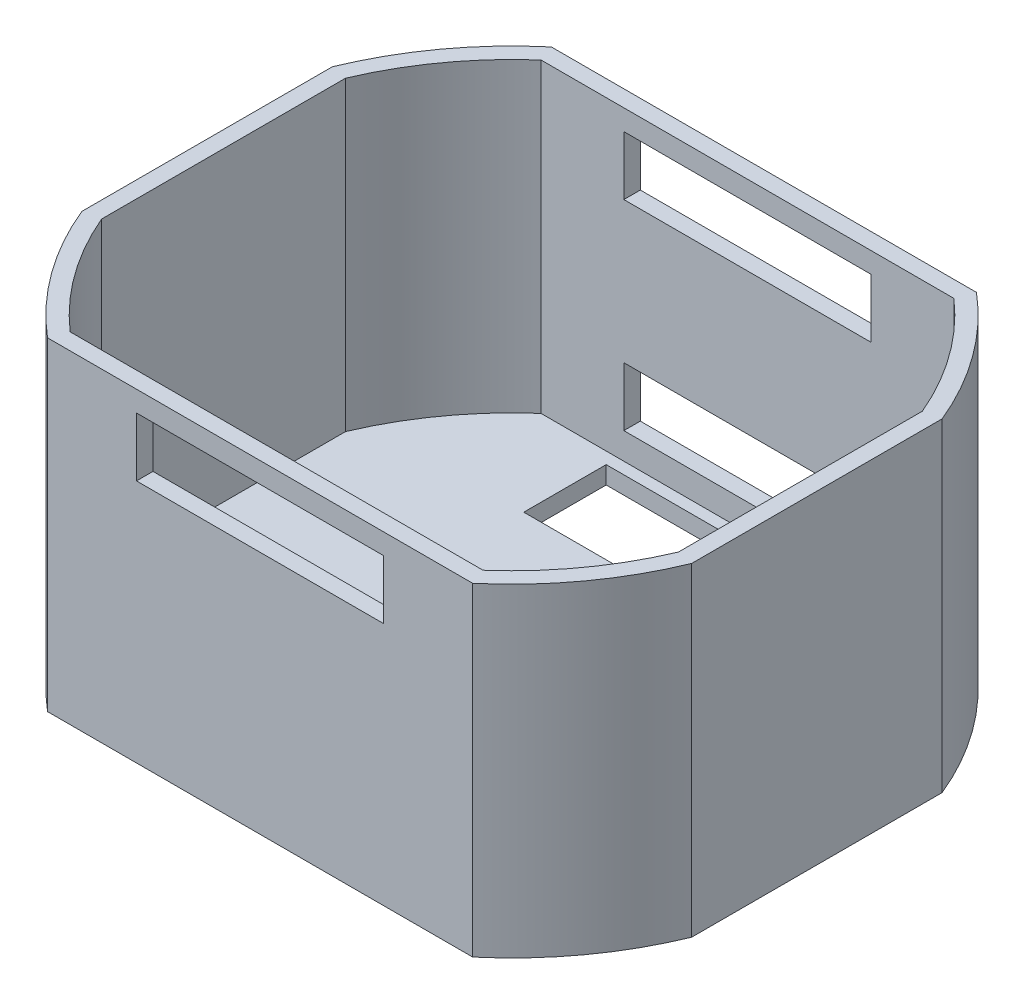
ISO-10303-21;
HEADER;
FILE_DESCRIPTION(('STEP AP214'),'2;1');
FILE_NAME('part.step','',(''),(''),'','','');
FILE_SCHEMA(('AUTOMOTIVE_DESIGN { 1 0 10303 214 1 1 1 1 }'));
ENDSEC;
DATA;
#1=APPLICATION_CONTEXT('core data for automotive mechanical design processes');
#2=APPLICATION_PROTOCOL_DEFINITION('international standard','automotive_design',2000,#1);
#3=PRODUCT_CONTEXT('',#1,'mechanical');
#4=PRODUCT('Part','Part','',(#3));
#5=PRODUCT_RELATED_PRODUCT_CATEGORY('part','',(#4));
#6=PRODUCT_DEFINITION_FORMATION('','',#4);
#7=PRODUCT_DEFINITION_CONTEXT('part definition',#1,'design');
#8=PRODUCT_DEFINITION('design','',#6,#7);
#9=PRODUCT_DEFINITION_SHAPE('','',#8);
#10=(LENGTH_UNIT() NAMED_UNIT(*) SI_UNIT(.MILLI.,.METRE.));
#11=(NAMED_UNIT(*) PLANE_ANGLE_UNIT() SI_UNIT($,.RADIAN.));
#12=(NAMED_UNIT(*) SI_UNIT($,.STERADIAN.) SOLID_ANGLE_UNIT());
#13=UNCERTAINTY_MEASURE_WITH_UNIT(LENGTH_MEASURE(1.E-05),#10,'distance_accuracy_value','');
#14=(GEOMETRIC_REPRESENTATION_CONTEXT(3) GLOBAL_UNCERTAINTY_ASSIGNED_CONTEXT((#13)) GLOBAL_UNIT_ASSIGNED_CONTEXT((#10,
#11,#12)) REPRESENTATION_CONTEXT('',''));
#15=CARTESIAN_POINT('',(0.,0.,0.));
#16=DIRECTION('',(0.,0.,1.));
#17=DIRECTION('',(1.,0.,0.));
#18=AXIS2_PLACEMENT_3D('',#15,#16,#17);
#19=CARTESIAN_POINT('',(0.,13.75,0.));
#20=DIRECTION('',(0.,-1.,0.));
#21=DIRECTION('',(0.,0.,-1.));
#22=AXIS2_PLACEMENT_3D('',#19,#20,#21);
#23=CYLINDRICAL_SURFACE('',#22,26.6);
#24=DIRECTION('',(0.,-1.,0.));
#25=VECTOR('',#24,1.);
#26=CARTESIAN_POINT('',(-24.5,13.75,-10.3590540108641));
#27=LINE('',#26,#25);
#28=CARTESIAN_POINT('',(-24.5,13.75,-10.3590540108641));
#29=VERTEX_POINT('',#28);
#30=CARTESIAN_POINT('',(-24.5,-12.25,-10.3590540108641));
#31=VERTEX_POINT('',#30);
#32=EDGE_CURVE('E414',#29,#31,#27,.T.);
#33=ORIENTED_EDGE('',*,*,#32,.T.);
#34=CARTESIAN_POINT('',(0.,-12.25,0.));
#35=DIRECTION('',(0.,-1.,0.));
#36=DIRECTION('',(0.,0.,-1.));
#37=AXIS2_PLACEMENT_3D('',#34,#35,#36);
#38=CIRCLE('',#37,26.6);
#39=CARTESIAN_POINT('',(-17.5373886311503,-12.25,-20.));
#40=VERTEX_POINT('',#39);
#41=EDGE_CURVE('E326',#31,#40,#38,.T.);
#42=ORIENTED_EDGE('',*,*,#41,.T.);
#43=DIRECTION('',(0.,-1.,0.));
#44=VECTOR('',#43,1.);
#45=CARTESIAN_POINT('',(-17.5373886311503,13.75,-20.));
#46=LINE('',#45,#44);
#47=CARTESIAN_POINT('',(-17.5373886311503,13.75,-20.));
#48=VERTEX_POINT('',#47);
#49=EDGE_CURVE('E393',#48,#40,#46,.T.);
#50=ORIENTED_EDGE('',*,*,#49,.F.);
#51=CARTESIAN_POINT('',(0.,13.75,0.));
#52=DIRECTION('',(0.,1.,0.));
#53=DIRECTION('',(0.,0.,1.));
#54=AXIS2_PLACEMENT_3D('',#51,#52,#53);
#55=CIRCLE('',#54,26.6);
#56=EDGE_CURVE('E376',#48,#29,#55,.T.);
#57=ORIENTED_EDGE('',*,*,#56,.T.);
#58=EDGE_LOOP('',(#33,#42,#50,#57));
#59=FACE_BOUND('',#58,.T.);
#60=ADVANCED_FACE('F33',(#59),#23,.F.);
#61=CARTESIAN_POINT('',(-24.5,13.75,-10.3590540108641));
#62=DIRECTION('',(1.,0.,0.));
#63=DIRECTION('',(0.,0.,-1.));
#64=AXIS2_PLACEMENT_3D('',#61,#62,#63);
#65=PLANE('',#64);
#66=DIRECTION('',(0.,-1.,0.));
#67=VECTOR('',#66,1.);
#68=CARTESIAN_POINT('',(-24.5,13.75,10.3590540108641));
#69=LINE('',#68,#67);
#70=CARTESIAN_POINT('',(-24.5,13.75,10.3590540108641));
#71=VERTEX_POINT('',#70);
#72=CARTESIAN_POINT('',(-24.5,-12.25,10.3590540108641));
#73=VERTEX_POINT('',#72);
#74=EDGE_CURVE('E411',#71,#73,#69,.T.);
#75=ORIENTED_EDGE('',*,*,#74,.T.);
#76=DIRECTION('',(0.,0.,-1.));
#77=VECTOR('',#76,1.);
#78=CARTESIAN_POINT('',(-24.5,-12.25,-10.3590540108641));
#79=LINE('',#78,#77);
#80=EDGE_CURVE('E323',#73,#31,#79,.T.);
#81=ORIENTED_EDGE('',*,*,#80,.T.);
#82=ORIENTED_EDGE('',*,*,#32,.F.);
#83=DIRECTION('',(0.,0.,1.));
#84=VECTOR('',#83,1.);
#85=CARTESIAN_POINT('',(-24.5,13.75,-10.3590540108641));
#86=LINE('',#85,#84);
#87=EDGE_CURVE('E378',#29,#71,#86,.T.);
#88=ORIENTED_EDGE('',*,*,#87,.T.);
#89=EDGE_LOOP('',(#75,#81,#82,#88));
#90=FACE_BOUND('',#89,.T.);
#91=ADVANCED_FACE('F516',(#90),#65,.T.);
#92=CARTESIAN_POINT('',(0.,13.75,0.));
#93=DIRECTION('',(0.,-1.,0.));
#94=DIRECTION('',(0.,0.,-1.));
#95=AXIS2_PLACEMENT_3D('',#92,#93,#94);
#96=CYLINDRICAL_SURFACE('',#95,26.6);
#97=DIRECTION('',(0.,-1.,0.));
#98=VECTOR('',#97,1.);
#99=CARTESIAN_POINT('',(-17.5373886311503,13.75,20.));
#100=LINE('',#99,#98);
#101=CARTESIAN_POINT('',(-17.5373886311503,13.75,20.));
#102=VERTEX_POINT('',#101);
#103=CARTESIAN_POINT('',(-17.5373886311503,-12.25,20.));
#104=VERTEX_POINT('',#103);
#105=EDGE_CURVE('E408',#102,#104,#100,.T.);
#106=ORIENTED_EDGE('',*,*,#105,.T.);
#107=CARTESIAN_POINT('',(0.,-12.25,0.));
#108=DIRECTION('',(0.,-1.,0.));
#109=DIRECTION('',(0.,0.,-1.));
#110=AXIS2_PLACEMENT_3D('',#107,#108,#109);
#111=CIRCLE('',#110,26.6);
#112=EDGE_CURVE('E320',#104,#73,#111,.T.);
#113=ORIENTED_EDGE('',*,*,#112,.T.);
#114=ORIENTED_EDGE('',*,*,#74,.F.);
#115=CARTESIAN_POINT('',(0.,13.75,0.));
#116=DIRECTION('',(0.,1.,0.));
#117=DIRECTION('',(0.,0.,1.));
#118=AXIS2_PLACEMENT_3D('',#115,#116,#117);
#119=CIRCLE('',#118,26.6);
#120=EDGE_CURVE('E380',#71,#102,#119,.T.);
#121=ORIENTED_EDGE('',*,*,#120,.T.);
#122=EDGE_LOOP('',(#106,#113,#114,#121));
#123=FACE_BOUND('',#122,.T.);
#124=ADVANCED_FACE('F522',(#123),#96,.F.);
#125=CARTESIAN_POINT('',(-17.5373886311503,13.75,20.));
#126=DIRECTION('',(0.,0.,-1.));
#127=DIRECTION('',(-1.,0.,0.));
#128=AXIS2_PLACEMENT_3D('',#125,#126,#127);
#129=PLANE('',#128);
#130=DIRECTION('',(0.,-1.,0.));
#131=VECTOR('',#130,1.);
#132=CARTESIAN_POINT('',(10.5,13.75,20.));
#133=LINE('',#132,#131);
#134=CARTESIAN_POINT('',(10.5,12.,20.));
#135=VERTEX_POINT('',#134);
#136=CARTESIAN_POINT('',(10.5,7.,20.));
#137=VERTEX_POINT('',#136);
#138=EDGE_CURVE('E374',#135,#137,#133,.T.);
#139=ORIENTED_EDGE('',*,*,#138,.F.);
#140=DIRECTION('',(1.,0.,0.));
#141=VECTOR('',#140,1.);
#142=CARTESIAN_POINT('',(-17.5373886311503,12.,20.));
#143=LINE('',#142,#141);
#144=CARTESIAN_POINT('',(-10.5,12.,20.));
#145=VERTEX_POINT('',#144);
#146=EDGE_CURVE('E356',#145,#135,#143,.T.);
#147=ORIENTED_EDGE('',*,*,#146,.F.);
#148=DIRECTION('',(0.,1.,0.));
#149=VECTOR('',#148,1.);
#150=CARTESIAN_POINT('',(-10.5,13.75,20.));
#151=LINE('',#150,#149);
#152=CARTESIAN_POINT('',(-10.5,7.,20.));
#153=VERTEX_POINT('',#152);
#154=EDGE_CURVE('E369',#153,#145,#151,.T.);
#155=ORIENTED_EDGE('',*,*,#154,.F.);
#156=DIRECTION('',(-1.,0.,0.));
#157=VECTOR('',#156,1.);
#158=CARTESIAN_POINT('',(-17.5373886311503,7.,20.));
#159=LINE('',#158,#157);
#160=EDGE_CURVE('E372',#137,#153,#159,.T.);
#161=ORIENTED_EDGE('',*,*,#160,.F.);
#162=EDGE_LOOP('',(#139,#147,#155,#161));
#163=FACE_BOUND('',#162,.T.);
#164=DIRECTION('',(0.,-1.,0.));
#165=VECTOR('',#164,1.);
#166=CARTESIAN_POINT('',(17.5373886311503,13.75,20.));
#167=LINE('',#166,#165);
#168=CARTESIAN_POINT('',(17.5373886311503,13.75,20.));
#169=VERTEX_POINT('',#168);
#170=CARTESIAN_POINT('',(17.5373886311503,-12.25,20.));
#171=VERTEX_POINT('',#170);
#172=EDGE_CURVE('E405',#169,#171,#167,.T.);
#173=ORIENTED_EDGE('',*,*,#172,.T.);
#174=DIRECTION('',(-1.,0.,0.));
#175=VECTOR('',#174,1.);
#176=CARTESIAN_POINT('',(-17.5373886311503,-12.25,20.));
#177=LINE('',#176,#175);
#178=EDGE_CURVE('E317',#171,#104,#177,.T.);
#179=ORIENTED_EDGE('',*,*,#178,.T.);
#180=ORIENTED_EDGE('',*,*,#105,.F.);
#181=DIRECTION('',(1.,0.,0.));
#182=VECTOR('',#181,1.);
#183=CARTESIAN_POINT('',(-17.5373886311503,13.75,20.));
#184=LINE('',#183,#182);
#185=EDGE_CURVE('E382',#102,#169,#184,.T.);
#186=ORIENTED_EDGE('',*,*,#185,.T.);
#187=EDGE_LOOP('',(#173,#179,#180,#186));
#188=FACE_BOUND('',#187,.T.);
#189=ADVANCED_FACE('F605',(#163,#188),#129,.T.);
#190=CARTESIAN_POINT('',(0.,13.75,0.));
#191=DIRECTION('',(0.,-1.,0.));
#192=DIRECTION('',(0.,0.,-1.));
#193=AXIS2_PLACEMENT_3D('',#190,#191,#192);
#194=CYLINDRICAL_SURFACE('',#193,26.6);
#195=DIRECTION('',(0.,-1.,0.));
#196=VECTOR('',#195,1.);
#197=CARTESIAN_POINT('',(24.5,13.75,10.3590540108641));
#198=LINE('',#197,#196);
#199=CARTESIAN_POINT('',(24.5,13.75,10.3590540108641));
#200=VERTEX_POINT('',#199);
#201=CARTESIAN_POINT('',(24.5,-12.25,10.3590540108641));
#202=VERTEX_POINT('',#201);
#203=EDGE_CURVE('E402',#200,#202,#198,.T.);
#204=ORIENTED_EDGE('',*,*,#203,.T.);
#205=CARTESIAN_POINT('',(0.,-12.25,0.));
#206=DIRECTION('',(0.,-1.,0.));
#207=DIRECTION('',(0.,0.,-1.));
#208=AXIS2_PLACEMENT_3D('',#205,#206,#207);
#209=CIRCLE('',#208,26.6);
#210=EDGE_CURVE('E314',#202,#171,#209,.T.);
#211=ORIENTED_EDGE('',*,*,#210,.T.);
#212=ORIENTED_EDGE('',*,*,#172,.F.);
#213=CARTESIAN_POINT('',(0.,13.75,0.));
#214=DIRECTION('',(0.,1.,0.));
#215=DIRECTION('',(0.,0.,1.));
#216=AXIS2_PLACEMENT_3D('',#213,#214,#215);
#217=CIRCLE('',#216,26.6);
#218=EDGE_CURVE('E384',#169,#200,#217,.T.);
#219=ORIENTED_EDGE('',*,*,#218,.T.);
#220=EDGE_LOOP('',(#204,#211,#212,#219));
#221=FACE_BOUND('',#220,.T.);
#222=ADVANCED_FACE('F627',(#221),#194,.F.);
#223=CARTESIAN_POINT('',(24.5,13.75,-10.3590540108641));
#224=DIRECTION('',(-1.,0.,0.));
#225=DIRECTION('',(0.,0.,1.));
#226=AXIS2_PLACEMENT_3D('',#223,#224,#225);
#227=PLANE('',#226);
#228=DIRECTION('',(0.,-1.,0.));
#229=VECTOR('',#228,1.);
#230=CARTESIAN_POINT('',(24.5,13.75,-10.3590540108641));
#231=LINE('',#230,#229);
#232=CARTESIAN_POINT('',(24.5,13.75,-10.3590540108641));
#233=VERTEX_POINT('',#232);
#234=CARTESIAN_POINT('',(24.5,-12.25,-10.3590540108641));
#235=VERTEX_POINT('',#234);
#236=EDGE_CURVE('E399',#233,#235,#231,.T.);
#237=ORIENTED_EDGE('',*,*,#236,.T.);
#238=DIRECTION('',(0.,0.,1.));
#239=VECTOR('',#238,1.);
#240=CARTESIAN_POINT('',(24.5,-12.25,-10.3590540108641));
#241=LINE('',#240,#239);
#242=EDGE_CURVE('E311',#235,#202,#241,.T.);
#243=ORIENTED_EDGE('',*,*,#242,.T.);
#244=ORIENTED_EDGE('',*,*,#203,.F.);
#245=DIRECTION('',(0.,0.,-1.));
#246=VECTOR('',#245,1.);
#247=CARTESIAN_POINT('',(24.5,13.75,-10.3590540108641));
#248=LINE('',#247,#246);
#249=EDGE_CURVE('E386',#200,#233,#248,.T.);
#250=ORIENTED_EDGE('',*,*,#249,.T.);
#251=EDGE_LOOP('',(#237,#243,#244,#250));
#252=FACE_BOUND('',#251,.T.);
#253=ADVANCED_FACE('F623',(#252),#227,.T.);
#254=CARTESIAN_POINT('',(0.,13.75,0.));
#255=DIRECTION('',(0.,-1.,0.));
#256=DIRECTION('',(0.,0.,-1.));
#257=AXIS2_PLACEMENT_3D('',#254,#255,#256);
#258=CYLINDRICAL_SURFACE('',#257,26.6);
#259=DIRECTION('',(0.,-1.,0.));
#260=VECTOR('',#259,1.);
#261=CARTESIAN_POINT('',(17.5373886311503,13.75,-20.));
#262=LINE('',#261,#260);
#263=CARTESIAN_POINT('',(17.5373886311503,13.75,-20.));
#264=VERTEX_POINT('',#263);
#265=CARTESIAN_POINT('',(17.5373886311503,-12.25,-20.));
#266=VERTEX_POINT('',#265);
#267=EDGE_CURVE('E396',#264,#266,#262,.T.);
#268=ORIENTED_EDGE('',*,*,#267,.T.);
#269=CARTESIAN_POINT('',(0.,-12.25,0.));
#270=DIRECTION('',(0.,-1.,0.));
#271=DIRECTION('',(0.,0.,-1.));
#272=AXIS2_PLACEMENT_3D('',#269,#270,#271);
#273=CIRCLE('',#272,26.6);
#274=EDGE_CURVE('E308',#266,#235,#273,.T.);
#275=ORIENTED_EDGE('',*,*,#274,.T.);
#276=ORIENTED_EDGE('',*,*,#236,.F.);
#277=CARTESIAN_POINT('',(0.,13.75,0.));
#278=DIRECTION('',(0.,1.,0.));
#279=DIRECTION('',(0.,0.,1.));
#280=AXIS2_PLACEMENT_3D('',#277,#278,#279);
#281=CIRCLE('',#280,26.6);
#282=EDGE_CURVE('E388',#233,#264,#281,.T.);
#283=ORIENTED_EDGE('',*,*,#282,.T.);
#284=EDGE_LOOP('',(#268,#275,#276,#283));
#285=FACE_BOUND('',#284,.T.);
#286=ADVANCED_FACE('F619',(#285),#258,.F.);
#287=CARTESIAN_POINT('',(-17.5373886311503,13.75,-20.));
#288=DIRECTION('',(0.,0.,1.));
#289=DIRECTION('',(1.,0.,0.));
#290=AXIS2_PLACEMENT_3D('',#287,#288,#289);
#291=PLANE('',#290);
#292=DIRECTION('',(0.,-1.,0.));
#293=VECTOR('',#292,1.);
#294=CARTESIAN_POINT('',(-10.5,13.75,-20.));
#295=LINE('',#294,#293);
#296=CARTESIAN_POINT('',(-10.5,-5.,-20.));
#297=VERTEX_POINT('',#296);
#298=CARTESIAN_POINT('',(-10.5,-10.,-20.));
#299=VERTEX_POINT('',#298);
#300=EDGE_CURVE('E306',#297,#299,#295,.T.);
#301=ORIENTED_EDGE('',*,*,#300,.F.);
#302=DIRECTION('',(-1.,0.,0.));
#303=VECTOR('',#302,1.);
#304=CARTESIAN_POINT('',(-17.5373886311503,-5.,-20.));
#305=LINE('',#304,#303);
#306=CARTESIAN_POINT('',(10.5,-5.,-20.));
#307=VERTEX_POINT('',#306);
#308=EDGE_CURVE('E293',#307,#297,#305,.T.);
#309=ORIENTED_EDGE('',*,*,#308,.F.);
#310=DIRECTION('',(0.,1.,0.));
#311=VECTOR('',#310,1.);
#312=CARTESIAN_POINT('',(10.5,13.75,-20.));
#313=LINE('',#312,#311);
#314=CARTESIAN_POINT('',(10.5,-10.,-20.));
#315=VERTEX_POINT('',#314);
#316=EDGE_CURVE('E301',#315,#307,#313,.T.);
#317=ORIENTED_EDGE('',*,*,#316,.F.);
#318=DIRECTION('',(1.,0.,0.));
#319=VECTOR('',#318,1.);
#320=CARTESIAN_POINT('',(-17.5373886311503,-10.,-20.));
#321=LINE('',#320,#319);
#322=EDGE_CURVE('E304',#299,#315,#321,.T.);
#323=ORIENTED_EDGE('',*,*,#322,.F.);
#324=EDGE_LOOP('',(#301,#309,#317,#323));
#325=FACE_BOUND('',#324,.T.);
#326=DIRECTION('',(0.,1.,0.));
#327=VECTOR('',#326,1.);
#328=CARTESIAN_POINT('',(10.5,13.75,-20.));
#329=LINE('',#328,#327);
#330=CARTESIAN_POINT('',(10.5,7.,-20.));
#331=VERTEX_POINT('',#330);
#332=CARTESIAN_POINT('',(10.5,12.,-20.));
#333=VERTEX_POINT('',#332);
#334=EDGE_CURVE('E41',#331,#333,#329,.T.);
#335=ORIENTED_EDGE('',*,*,#334,.F.);
#336=DIRECTION('',(1.,0.,0.));
#337=VECTOR('',#336,1.);
#338=CARTESIAN_POINT('',(-17.5373886311503,7.,-20.));
#339=LINE('',#338,#337);
#340=CARTESIAN_POINT('',(-10.5,7.,-20.));
#341=VERTEX_POINT('',#340);
#342=EDGE_CURVE('E478',#341,#331,#339,.T.);
#343=ORIENTED_EDGE('',*,*,#342,.F.);
#344=DIRECTION('',(0.,-1.,0.));
#345=VECTOR('',#344,1.);
#346=CARTESIAN_POINT('',(-10.5,13.75,-20.));
#347=LINE('',#346,#345);
#348=CARTESIAN_POINT('',(-10.5,12.,-20.));
#349=VERTEX_POINT('',#348);
#350=EDGE_CURVE('E476',#349,#341,#347,.T.);
#351=ORIENTED_EDGE('',*,*,#350,.F.);
#352=DIRECTION('',(-1.,0.,0.));
#353=VECTOR('',#352,1.);
#354=CARTESIAN_POINT('',(-17.5373886311503,12.,-20.));
#355=LINE('',#354,#353);
#356=EDGE_CURVE('E474',#333,#349,#355,.T.);
#357=ORIENTED_EDGE('',*,*,#356,.F.);
#358=EDGE_LOOP('',(#335,#343,#351,#357));
#359=FACE_BOUND('',#358,.T.);
#360=ORIENTED_EDGE('',*,*,#49,.T.);
#361=DIRECTION('',(1.,0.,0.));
#362=VECTOR('',#361,1.);
#363=CARTESIAN_POINT('',(-17.5373886311503,-12.25,-20.));
#364=LINE('',#363,#362);
#365=EDGE_CURVE('E11',#40,#266,#364,.T.);
#366=ORIENTED_EDGE('',*,*,#365,.T.);
#367=ORIENTED_EDGE('',*,*,#267,.F.);
#368=DIRECTION('',(-1.,0.,0.));
#369=VECTOR('',#368,1.);
#370=CARTESIAN_POINT('',(-17.5373886311503,13.75,-20.));
#371=LINE('',#370,#369);
#372=EDGE_CURVE('E391',#264,#48,#371,.T.);
#373=ORIENTED_EDGE('',*,*,#372,.T.);
#374=EDGE_LOOP('',(#360,#366,#367,#373));
#375=FACE_BOUND('',#374,.T.);
#376=ADVANCED_FACE('F489',(#325,#359,#375),#291,.T.);
#377=CARTESIAN_POINT('',(0.,13.75,0.));
#378=DIRECTION('',(0.,1.,0.));
#379=DIRECTION('',(0.,0.,1.));
#380=AXIS2_PLACEMENT_3D('',#377,#378,#379);
#381=PLANE('',#380);
#382=CARTESIAN_POINT('',(0.,13.75,0.));
#383=DIRECTION('',(0.,1.,0.));
#384=DIRECTION('',(0.,0.,1.));
#385=AXIS2_PLACEMENT_3D('',#382,#383,#384);
#386=CIRCLE('',#385,28.);
#387=CARTESIAN_POINT('',(-18.0565777488427,13.75,-21.4));
#388=VERTEX_POINT('',#387);
#389=CARTESIAN_POINT('',(-25.9,13.75,-10.6390789074995));
#390=VERTEX_POINT('',#389);
#391=EDGE_CURVE('E418',#388,#390,#386,.T.);
#392=ORIENTED_EDGE('',*,*,#391,.T.);
#393=DIRECTION('',(0.,0.,1.));
#394=VECTOR('',#393,1.);
#395=CARTESIAN_POINT('',(-25.9,13.75,-10.6390789074995));
#396=LINE('',#395,#394);
#397=CARTESIAN_POINT('',(-25.9,13.75,10.6390789074995));
#398=VERTEX_POINT('',#397);
#399=EDGE_CURVE('E421',#390,#398,#396,.T.);
#400=ORIENTED_EDGE('',*,*,#399,.T.);
#401=CARTESIAN_POINT('',(0.,13.75,0.));
#402=DIRECTION('',(0.,1.,0.));
#403=DIRECTION('',(0.,0.,1.));
#404=AXIS2_PLACEMENT_3D('',#401,#402,#403);
#405=CIRCLE('',#404,28.);
#406=CARTESIAN_POINT('',(-18.0565777488427,13.75,21.4));
#407=VERTEX_POINT('',#406);
#408=EDGE_CURVE('E424',#398,#407,#405,.T.);
#409=ORIENTED_EDGE('',*,*,#408,.T.);
#410=DIRECTION('',(1.,0.,0.));
#411=VECTOR('',#410,1.);
#412=CARTESIAN_POINT('',(-18.0565777488427,13.75,21.4));
#413=LINE('',#412,#411);
#414=CARTESIAN_POINT('',(18.0565777488427,13.75,21.4));
#415=VERTEX_POINT('',#414);
#416=EDGE_CURVE('E426',#407,#415,#413,.T.);
#417=ORIENTED_EDGE('',*,*,#416,.T.);
#418=CARTESIAN_POINT('',(0.,13.75,0.));
#419=DIRECTION('',(0.,1.,0.));
#420=DIRECTION('',(0.,0.,1.));
#421=AXIS2_PLACEMENT_3D('',#418,#419,#420);
#422=CIRCLE('',#421,28.);
#423=CARTESIAN_POINT('',(25.9,13.75,10.6390789074995));
#424=VERTEX_POINT('',#423);
#425=EDGE_CURVE('E428',#415,#424,#422,.T.);
#426=ORIENTED_EDGE('',*,*,#425,.T.);
#427=DIRECTION('',(0.,0.,-1.));
#428=VECTOR('',#427,1.);
#429=CARTESIAN_POINT('',(25.9,13.75,-10.6390789074995));
#430=LINE('',#429,#428);
#431=CARTESIAN_POINT('',(25.9,13.75,-10.6390789074995));
#432=VERTEX_POINT('',#431);
#433=EDGE_CURVE('E430',#424,#432,#430,.T.);
#434=ORIENTED_EDGE('',*,*,#433,.T.);
#435=CARTESIAN_POINT('',(0.,13.75,0.));
#436=DIRECTION('',(0.,1.,0.));
#437=DIRECTION('',(0.,0.,1.));
#438=AXIS2_PLACEMENT_3D('',#435,#436,#437);
#439=CIRCLE('',#438,28.);
#440=CARTESIAN_POINT('',(18.0565777488427,13.75,-21.4));
#441=VERTEX_POINT('',#440);
#442=EDGE_CURVE('E432',#432,#441,#439,.T.);
#443=ORIENTED_EDGE('',*,*,#442,.T.);
#444=DIRECTION('',(-1.,0.,0.));
#445=VECTOR('',#444,1.);
#446=CARTESIAN_POINT('',(-18.0565777488427,13.75,-21.4));
#447=LINE('',#446,#445);
#448=EDGE_CURVE('E434',#441,#388,#447,.T.);
#449=ORIENTED_EDGE('',*,*,#448,.T.);
#450=EDGE_LOOP('',(#392,#400,#409,#417,#426,#434,#443,#449));
#451=FACE_BOUND('',#450,.T.);
#452=ORIENTED_EDGE('',*,*,#87,.F.);
#453=ORIENTED_EDGE('',*,*,#56,.F.);
#454=ORIENTED_EDGE('',*,*,#372,.F.);
#455=ORIENTED_EDGE('',*,*,#282,.F.);
#456=ORIENTED_EDGE('',*,*,#249,.F.);
#457=ORIENTED_EDGE('',*,*,#218,.F.);
#458=ORIENTED_EDGE('',*,*,#185,.F.);
#459=ORIENTED_EDGE('',*,*,#120,.F.);
#460=EDGE_LOOP('',(#452,#453,#454,#455,#456,#457,#458,#459));
#461=FACE_BOUND('',#460,.T.);
#462=ADVANCED_FACE('F527',(#451,#461),#381,.T.);
#463=CARTESIAN_POINT('',(0.,-13.75,0.));
#464=DIRECTION('',(0.,1.,0.));
#465=DIRECTION('',(0.,0.,1.));
#466=AXIS2_PLACEMENT_3D('',#463,#464,#465);
#467=PLANE('',#466);
#468=DIRECTION('',(1.,0.,0.));
#469=VECTOR('',#468,1.);
#470=CARTESIAN_POINT('',(0.,-13.75,-12.));
#471=LINE('',#470,#469);
#472=CARTESIAN_POINT('',(-11.,-13.75,-12.));
#473=VERTEX_POINT('',#472);
#474=CARTESIAN_POINT('',(11.,-13.75,-12.));
#475=VERTEX_POINT('',#474);
#476=EDGE_CURVE('E273',#473,#475,#471,.T.);
#477=ORIENTED_EDGE('',*,*,#476,.T.);
#478=DIRECTION('',(0.,0.,-1.));
#479=VECTOR('',#478,1.);
#480=CARTESIAN_POINT('',(11.,-13.75,0.));
#481=LINE('',#480,#479);
#482=CARTESIAN_POINT('',(11.,-13.75,-19.));
#483=VERTEX_POINT('',#482);
#484=EDGE_CURVE('E276',#475,#483,#481,.T.);
#485=ORIENTED_EDGE('',*,*,#484,.T.);
#486=DIRECTION('',(-1.,0.,0.));
#487=VECTOR('',#486,1.);
#488=CARTESIAN_POINT('',(0.,-13.75,-19.));
#489=LINE('',#488,#487);
#490=CARTESIAN_POINT('',(-11.,-13.75,-19.));
#491=VERTEX_POINT('',#490);
#492=EDGE_CURVE('E268',#483,#491,#489,.T.);
#493=ORIENTED_EDGE('',*,*,#492,.T.);
#494=DIRECTION('',(0.,0.,1.));
#495=VECTOR('',#494,1.);
#496=CARTESIAN_POINT('',(-11.,-13.75,0.));
#497=LINE('',#496,#495);
#498=EDGE_CURVE('E248',#491,#473,#497,.T.);
#499=ORIENTED_EDGE('',*,*,#498,.T.);
#500=EDGE_LOOP('',(#477,#485,#493,#499));
#501=FACE_BOUND('',#500,.T.);
#502=CARTESIAN_POINT('',(0.,-13.75,0.));
#503=DIRECTION('',(0.,1.,0.));
#504=DIRECTION('',(0.,0.,1.));
#505=AXIS2_PLACEMENT_3D('',#502,#503,#504);
#506=CIRCLE('',#505,28.);
#507=CARTESIAN_POINT('',(-18.0565777488427,-13.75,-21.4));
#508=VERTEX_POINT('',#507);
#509=CARTESIAN_POINT('',(-25.9,-13.75,-10.6390789074995));
#510=VERTEX_POINT('',#509);
#511=EDGE_CURVE('E417',#508,#510,#506,.T.);
#512=ORIENTED_EDGE('',*,*,#511,.F.);
#513=DIRECTION('',(-1.,0.,0.));
#514=VECTOR('',#513,1.);
#515=CARTESIAN_POINT('',(-18.0565777488427,-13.75,-21.4));
#516=LINE('',#515,#514);
#517=CARTESIAN_POINT('',(18.0565777488427,-13.75,-21.4));
#518=VERTEX_POINT('',#517);
#519=EDGE_CURVE('E422',#518,#508,#516,.T.);
#520=ORIENTED_EDGE('',*,*,#519,.F.);
#521=CARTESIAN_POINT('',(0.,-13.75,0.));
#522=DIRECTION('',(0.,1.,0.));
#523=DIRECTION('',(0.,0.,1.));
#524=AXIS2_PLACEMENT_3D('',#521,#522,#523);
#525=CIRCLE('',#524,28.);
#526=CARTESIAN_POINT('',(25.9,-13.75,-10.6390789074995));
#527=VERTEX_POINT('',#526);
#528=EDGE_CURVE('E454',#527,#518,#525,.T.);
#529=ORIENTED_EDGE('',*,*,#528,.F.);
#530=DIRECTION('',(0.,0.,-1.));
#531=VECTOR('',#530,1.);
#532=CARTESIAN_POINT('',(25.9,-13.75,-10.6390789074995));
#533=LINE('',#532,#531);
#534=CARTESIAN_POINT('',(25.9,-13.75,10.6390789074995));
#535=VERTEX_POINT('',#534);
#536=EDGE_CURVE('E451',#535,#527,#533,.T.);
#537=ORIENTED_EDGE('',*,*,#536,.F.);
#538=CARTESIAN_POINT('',(0.,-13.75,0.));
#539=DIRECTION('',(0.,1.,0.));
#540=DIRECTION('',(0.,0.,1.));
#541=AXIS2_PLACEMENT_3D('',#538,#539,#540);
#542=CIRCLE('',#541,28.);
#543=CARTESIAN_POINT('',(18.0565777488427,-13.75,21.4));
#544=VERTEX_POINT('',#543);
#545=EDGE_CURVE('E448',#544,#535,#542,.T.);
#546=ORIENTED_EDGE('',*,*,#545,.F.);
#547=DIRECTION('',(1.,0.,0.));
#548=VECTOR('',#547,1.);
#549=CARTESIAN_POINT('',(-18.0565777488427,-13.75,21.4));
#550=LINE('',#549,#548);
#551=CARTESIAN_POINT('',(-18.0565777488427,-13.75,21.4));
#552=VERTEX_POINT('',#551);
#553=EDGE_CURVE('E445',#552,#544,#550,.T.);
#554=ORIENTED_EDGE('',*,*,#553,.F.);
#555=CARTESIAN_POINT('',(0.,-13.75,0.));
#556=DIRECTION('',(0.,1.,0.));
#557=DIRECTION('',(0.,0.,1.));
#558=AXIS2_PLACEMENT_3D('',#555,#556,#557);
#559=CIRCLE('',#558,28.);
#560=CARTESIAN_POINT('',(-25.9,-13.75,10.6390789074995));
#561=VERTEX_POINT('',#560);
#562=EDGE_CURVE('E442',#561,#552,#559,.T.);
#563=ORIENTED_EDGE('',*,*,#562,.F.);
#564=DIRECTION('',(0.,0.,1.));
#565=VECTOR('',#564,1.);
#566=CARTESIAN_POINT('',(-25.9,-13.75,-10.6390789074995));
#567=LINE('',#566,#565);
#568=EDGE_CURVE('E439',#510,#561,#567,.T.);
#569=ORIENTED_EDGE('',*,*,#568,.F.);
#570=EDGE_LOOP('',(#512,#520,#529,#537,#546,#554,#563,#569));
#571=FACE_BOUND('',#570,.T.);
#572=ADVANCED_FACE('F530',(#501,#571),#467,.F.);
#573=CARTESIAN_POINT('',(0.,13.75,0.));
#574=DIRECTION('',(0.,-1.,0.));
#575=DIRECTION('',(0.,0.,-1.));
#576=AXIS2_PLACEMENT_3D('',#573,#574,#575);
#577=CYLINDRICAL_SURFACE('',#576,28.);
#578=ORIENTED_EDGE('',*,*,#511,.T.);
#579=DIRECTION('',(0.,-1.,0.));
#580=VECTOR('',#579,1.);
#581=CARTESIAN_POINT('',(-25.9,13.75,-10.6390789074995));
#582=LINE('',#581,#580);
#583=EDGE_CURVE('E472',#390,#510,#582,.T.);
#584=ORIENTED_EDGE('',*,*,#583,.F.);
#585=ORIENTED_EDGE('',*,*,#391,.F.);
#586=DIRECTION('',(0.,-1.,0.));
#587=VECTOR('',#586,1.);
#588=CARTESIAN_POINT('',(-18.0565777488427,13.75,-21.4));
#589=LINE('',#588,#587);
#590=EDGE_CURVE('E436',#388,#508,#589,.T.);
#591=ORIENTED_EDGE('',*,*,#590,.T.);
#592=EDGE_LOOP('',(#578,#584,#585,#591));
#593=FACE_BOUND('',#592,.T.);
#594=ADVANCED_FACE('F35',(#593),#577,.T.);
#595=CARTESIAN_POINT('',(-25.9,13.75,-10.6390789074995));
#596=DIRECTION('',(1.,0.,0.));
#597=DIRECTION('',(0.,0.,-1.));
#598=AXIS2_PLACEMENT_3D('',#595,#596,#597);
#599=PLANE('',#598);
#600=ORIENTED_EDGE('',*,*,#568,.T.);
#601=DIRECTION('',(0.,-1.,0.));
#602=VECTOR('',#601,1.);
#603=CARTESIAN_POINT('',(-25.9,13.75,10.6390789074995));
#604=LINE('',#603,#602);
#605=EDGE_CURVE('E470',#398,#561,#604,.T.);
#606=ORIENTED_EDGE('',*,*,#605,.F.);
#607=ORIENTED_EDGE('',*,*,#399,.F.);
#608=ORIENTED_EDGE('',*,*,#583,.T.);
#609=EDGE_LOOP('',(#600,#606,#607,#608));
#610=FACE_BOUND('',#609,.T.);
#611=ADVANCED_FACE('F556',(#610),#599,.F.);
#612=CARTESIAN_POINT('',(0.,13.75,0.));
#613=DIRECTION('',(0.,-1.,0.));
#614=DIRECTION('',(0.,0.,-1.));
#615=AXIS2_PLACEMENT_3D('',#612,#613,#614);
#616=CYLINDRICAL_SURFACE('',#615,28.);
#617=ORIENTED_EDGE('',*,*,#562,.T.);
#618=DIRECTION('',(0.,-1.,0.));
#619=VECTOR('',#618,1.);
#620=CARTESIAN_POINT('',(-18.0565777488427,13.75,21.4));
#621=LINE('',#620,#619);
#622=EDGE_CURVE('E468',#407,#552,#621,.T.);
#623=ORIENTED_EDGE('',*,*,#622,.F.);
#624=ORIENTED_EDGE('',*,*,#408,.F.);
#625=ORIENTED_EDGE('',*,*,#605,.T.);
#626=EDGE_LOOP('',(#617,#623,#624,#625));
#627=FACE_BOUND('',#626,.T.);
#628=ADVANCED_FACE('F553',(#627),#616,.T.);
#629=CARTESIAN_POINT('',(-18.0565777488427,13.75,21.4));
#630=DIRECTION('',(0.,0.,-1.));
#631=DIRECTION('',(-1.,0.,0.));
#632=AXIS2_PLACEMENT_3D('',#629,#630,#631);
#633=PLANE('',#632);
#634=ORIENTED_EDGE('',*,*,#553,.T.);
#635=DIRECTION('',(0.,-1.,0.));
#636=VECTOR('',#635,1.);
#637=CARTESIAN_POINT('',(18.0565777488427,13.75,21.4));
#638=LINE('',#637,#636);
#639=EDGE_CURVE('E466',#415,#544,#638,.T.);
#640=ORIENTED_EDGE('',*,*,#639,.F.);
#641=ORIENTED_EDGE('',*,*,#416,.F.);
#642=ORIENTED_EDGE('',*,*,#622,.T.);
#643=EDGE_LOOP('',(#634,#640,#641,#642));
#644=FACE_BOUND('',#643,.T.);
#645=DIRECTION('',(-1.,0.,0.));
#646=VECTOR('',#645,1.);
#647=CARTESIAN_POINT('',(-10.5,12.,21.4));
#648=LINE('',#647,#646);
#649=CARTESIAN_POINT('',(10.5,12.,21.4));
#650=VERTEX_POINT('',#649);
#651=CARTESIAN_POINT('',(-10.5,12.,21.4));
#652=VERTEX_POINT('',#651);
#653=EDGE_CURVE('E331',#650,#652,#648,.T.);
#654=ORIENTED_EDGE('',*,*,#653,.F.);
#655=DIRECTION('',(0.,1.,0.));
#656=VECTOR('',#655,1.);
#657=CARTESIAN_POINT('',(10.5,12.,21.4));
#658=LINE('',#657,#656);
#659=CARTESIAN_POINT('',(10.5,7.,21.4));
#660=VERTEX_POINT('',#659);
#661=EDGE_CURVE('E329',#660,#650,#658,.T.);
#662=ORIENTED_EDGE('',*,*,#661,.F.);
#663=DIRECTION('',(1.,0.,0.));
#664=VECTOR('',#663,1.);
#665=CARTESIAN_POINT('',(-10.5,7.,21.4));
#666=LINE('',#665,#664);
#667=CARTESIAN_POINT('',(-10.5,7.,21.4));
#668=VERTEX_POINT('',#667);
#669=EDGE_CURVE('E337',#668,#660,#666,.T.);
#670=ORIENTED_EDGE('',*,*,#669,.F.);
#671=DIRECTION('',(0.,-1.,0.));
#672=VECTOR('',#671,1.);
#673=CARTESIAN_POINT('',(-10.5,12.,21.4));
#674=LINE('',#673,#672);
#675=EDGE_CURVE('E334',#652,#668,#674,.T.);
#676=ORIENTED_EDGE('',*,*,#675,.F.);
#677=EDGE_LOOP('',(#654,#662,#670,#676));
#678=FACE_BOUND('',#677,.T.);
#679=ADVANCED_FACE('F549',(#644,#678),#633,.F.);
#680=CARTESIAN_POINT('',(0.,13.75,0.));
#681=DIRECTION('',(0.,-1.,0.));
#682=DIRECTION('',(0.,0.,-1.));
#683=AXIS2_PLACEMENT_3D('',#680,#681,#682);
#684=CYLINDRICAL_SURFACE('',#683,28.);
#685=ORIENTED_EDGE('',*,*,#545,.T.);
#686=DIRECTION('',(0.,-1.,0.));
#687=VECTOR('',#686,1.);
#688=CARTESIAN_POINT('',(25.9,13.75,10.6390789074995));
#689=LINE('',#688,#687);
#690=EDGE_CURVE('E464',#424,#535,#689,.T.);
#691=ORIENTED_EDGE('',*,*,#690,.F.);
#692=ORIENTED_EDGE('',*,*,#425,.F.);
#693=ORIENTED_EDGE('',*,*,#639,.T.);
#694=EDGE_LOOP('',(#685,#691,#692,#693));
#695=FACE_BOUND('',#694,.T.);
#696=ADVANCED_FACE('F545',(#695),#684,.T.);
#697=CARTESIAN_POINT('',(25.9,13.75,-10.6390789074995));
#698=DIRECTION('',(-1.,0.,0.));
#699=DIRECTION('',(0.,0.,1.));
#700=AXIS2_PLACEMENT_3D('',#697,#698,#699);
#701=PLANE('',#700);
#702=ORIENTED_EDGE('',*,*,#536,.T.);
#703=DIRECTION('',(0.,-1.,0.));
#704=VECTOR('',#703,1.);
#705=CARTESIAN_POINT('',(25.9,13.75,-10.6390789074995));
#706=LINE('',#705,#704);
#707=EDGE_CURVE('E462',#432,#527,#706,.T.);
#708=ORIENTED_EDGE('',*,*,#707,.F.);
#709=ORIENTED_EDGE('',*,*,#433,.F.);
#710=ORIENTED_EDGE('',*,*,#690,.T.);
#711=EDGE_LOOP('',(#702,#708,#709,#710));
#712=FACE_BOUND('',#711,.T.);
#713=ADVANCED_FACE('F541',(#712),#701,.F.);
#714=CARTESIAN_POINT('',(0.,13.75,0.));
#715=DIRECTION('',(0.,-1.,0.));
#716=DIRECTION('',(0.,0.,-1.));
#717=AXIS2_PLACEMENT_3D('',#714,#715,#716);
#718=CYLINDRICAL_SURFACE('',#717,28.);
#719=ORIENTED_EDGE('',*,*,#528,.T.);
#720=DIRECTION('',(0.,-1.,0.));
#721=VECTOR('',#720,1.);
#722=CARTESIAN_POINT('',(18.0565777488427,13.75,-21.4));
#723=LINE('',#722,#721);
#724=EDGE_CURVE('E460',#441,#518,#723,.T.);
#725=ORIENTED_EDGE('',*,*,#724,.F.);
#726=ORIENTED_EDGE('',*,*,#442,.F.);
#727=ORIENTED_EDGE('',*,*,#707,.T.);
#728=EDGE_LOOP('',(#719,#725,#726,#727));
#729=FACE_BOUND('',#728,.T.);
#730=ADVANCED_FACE('F537',(#729),#718,.T.);
#731=CARTESIAN_POINT('',(-18.0565777488427,13.75,-21.4));
#732=DIRECTION('',(0.,0.,1.));
#733=DIRECTION('',(1.,0.,0.));
#734=AXIS2_PLACEMENT_3D('',#731,#732,#733);
#735=PLANE('',#734);
#736=DIRECTION('',(1.,0.,0.));
#737=VECTOR('',#736,1.);
#738=CARTESIAN_POINT('',(10.5,-5.,-21.4));
#739=LINE('',#738,#737);
#740=CARTESIAN_POINT('',(-10.5,-5.,-21.4));
#741=VERTEX_POINT('',#740);
#742=CARTESIAN_POINT('',(10.5,-5.,-21.4));
#743=VERTEX_POINT('',#742);
#744=EDGE_CURVE('E281',#741,#743,#739,.T.);
#745=ORIENTED_EDGE('',*,*,#744,.F.);
#746=DIRECTION('',(0.,1.,0.));
#747=VECTOR('',#746,1.);
#748=CARTESIAN_POINT('',(-10.5,-5.,-21.4));
#749=LINE('',#748,#747);
#750=CARTESIAN_POINT('',(-10.5,-10.,-21.4));
#751=VERTEX_POINT('',#750);
#752=EDGE_CURVE('E279',#751,#741,#749,.T.);
#753=ORIENTED_EDGE('',*,*,#752,.F.);
#754=DIRECTION('',(-1.,0.,0.));
#755=VECTOR('',#754,1.);
#756=CARTESIAN_POINT('',(10.5,-10.,-21.4));
#757=LINE('',#756,#755);
#758=CARTESIAN_POINT('',(10.5,-10.,-21.4));
#759=VERTEX_POINT('',#758);
#760=EDGE_CURVE('E287',#759,#751,#757,.T.);
#761=ORIENTED_EDGE('',*,*,#760,.F.);
#762=DIRECTION('',(0.,-1.,0.));
#763=VECTOR('',#762,1.);
#764=CARTESIAN_POINT('',(10.5,-5.,-21.4));
#765=LINE('',#764,#763);
#766=EDGE_CURVE('E284',#743,#759,#765,.T.);
#767=ORIENTED_EDGE('',*,*,#766,.F.);
#768=EDGE_LOOP('',(#745,#753,#761,#767));
#769=FACE_BOUND('',#768,.T.);
#770=ORIENTED_EDGE('',*,*,#519,.T.);
#771=ORIENTED_EDGE('',*,*,#590,.F.);
#772=ORIENTED_EDGE('',*,*,#448,.F.);
#773=ORIENTED_EDGE('',*,*,#724,.T.);
#774=EDGE_LOOP('',(#770,#771,#772,#773));
#775=FACE_BOUND('',#774,.T.);
#776=DIRECTION('',(1.,0.,0.));
#777=VECTOR('',#776,1.);
#778=CARTESIAN_POINT('',(-10.5,7.,-21.4));
#779=LINE('',#778,#777);
#780=CARTESIAN_POINT('',(-10.5,7.,-21.4));
#781=VERTEX_POINT('',#780);
#782=CARTESIAN_POINT('',(10.5,7.,-21.4));
#783=VERTEX_POINT('',#782);
#784=EDGE_CURVE('E349',#781,#783,#779,.T.);
#785=ORIENTED_EDGE('',*,*,#784,.T.);
#786=DIRECTION('',(0.,1.,0.));
#787=VECTOR('',#786,1.);
#788=CARTESIAN_POINT('',(10.5,12.,-21.4));
#789=LINE('',#788,#787);
#790=CARTESIAN_POINT('',(10.5,12.,-21.4));
#791=VERTEX_POINT('',#790);
#792=EDGE_CURVE('E340',#783,#791,#789,.T.);
#793=ORIENTED_EDGE('',*,*,#792,.T.);
#794=DIRECTION('',(-1.,0.,0.));
#795=VECTOR('',#794,1.);
#796=CARTESIAN_POINT('',(-10.5,12.,-21.4));
#797=LINE('',#796,#795);
#798=CARTESIAN_POINT('',(-10.5,12.,-21.4));
#799=VERTEX_POINT('',#798);
#800=EDGE_CURVE('E343',#791,#799,#797,.T.);
#801=ORIENTED_EDGE('',*,*,#800,.T.);
#802=DIRECTION('',(0.,-1.,0.));
#803=VECTOR('',#802,1.);
#804=CARTESIAN_POINT('',(-10.5,12.,-21.4));
#805=LINE('',#804,#803);
#806=EDGE_CURVE('E346',#799,#781,#805,.T.);
#807=ORIENTED_EDGE('',*,*,#806,.T.);
#808=EDGE_LOOP('',(#785,#793,#801,#807));
#809=FACE_BOUND('',#808,.T.);
#810=ADVANCED_FACE('F498',(#769,#775,#809),#735,.F.);
#811=CARTESIAN_POINT('',(-10.5,12.,-21.4));
#812=DIRECTION('',(0.,1.,0.));
#813=DIRECTION('',(0.,0.,1.));
#814=AXIS2_PLACEMENT_3D('',#811,#812,#813);
#815=PLANE('',#814);
#816=ORIENTED_EDGE('',*,*,#356,.T.);
#817=DIRECTION('',(0.,0.,1.));
#818=VECTOR('',#817,1.);
#819=CARTESIAN_POINT('',(-10.5,12.,-21.4));
#820=LINE('',#819,#818);
#821=EDGE_CURVE('E362',#799,#349,#820,.T.);
#822=ORIENTED_EDGE('',*,*,#821,.F.);
#823=ORIENTED_EDGE('',*,*,#800,.F.);
#824=DIRECTION('',(0.,0.,1.));
#825=VECTOR('',#824,1.);
#826=CARTESIAN_POINT('',(10.5,12.,-21.4));
#827=LINE('',#826,#825);
#828=EDGE_CURVE('E366',#791,#333,#827,.T.);
#829=ORIENTED_EDGE('',*,*,#828,.T.);
#830=EDGE_LOOP('',(#816,#822,#823,#829));
#831=FACE_BOUND('',#830,.T.);
#832=ADVANCED_FACE('F493',(#831),#815,.F.);
#833=CARTESIAN_POINT('',(-10.5,12.,-21.4));
#834=DIRECTION('',(-1.,0.,0.));
#835=DIRECTION('',(0.,-1.,0.));
#836=AXIS2_PLACEMENT_3D('',#833,#834,#835);
#837=PLANE('',#836);
#838=ORIENTED_EDGE('',*,*,#350,.T.);
#839=DIRECTION('',(0.,0.,1.));
#840=VECTOR('',#839,1.);
#841=CARTESIAN_POINT('',(-10.5,7.,-21.4));
#842=LINE('',#841,#840);
#843=EDGE_CURVE('E358',#781,#341,#842,.T.);
#844=ORIENTED_EDGE('',*,*,#843,.F.);
#845=ORIENTED_EDGE('',*,*,#806,.F.);
#846=ORIENTED_EDGE('',*,*,#821,.T.);
#847=EDGE_LOOP('',(#838,#844,#845,#846));
#848=FACE_BOUND('',#847,.T.);
#849=ADVANCED_FACE('F495',(#848),#837,.F.);
#850=CARTESIAN_POINT('',(-10.5,7.,-21.4));
#851=DIRECTION('',(0.,-1.,0.));
#852=DIRECTION('',(0.,0.,-1.));
#853=AXIS2_PLACEMENT_3D('',#850,#851,#852);
#854=PLANE('',#853);
#855=ORIENTED_EDGE('',*,*,#342,.T.);
#856=DIRECTION('',(0.,0.,1.));
#857=VECTOR('',#856,1.);
#858=CARTESIAN_POINT('',(10.5,7.,-21.4));
#859=LINE('',#858,#857);
#860=EDGE_CURVE('E353',#783,#331,#859,.T.);
#861=ORIENTED_EDGE('',*,*,#860,.F.);
#862=ORIENTED_EDGE('',*,*,#784,.F.);
#863=ORIENTED_EDGE('',*,*,#843,.T.);
#864=EDGE_LOOP('',(#855,#861,#862,#863));
#865=FACE_BOUND('',#864,.T.);
#866=ADVANCED_FACE('F500',(#865),#854,.F.);
#867=CARTESIAN_POINT('',(10.5,12.,-21.4));
#868=DIRECTION('',(1.,0.,0.));
#869=DIRECTION('',(0.,1.,0.));
#870=AXIS2_PLACEMENT_3D('',#867,#868,#869);
#871=PLANE('',#870);
#872=ORIENTED_EDGE('',*,*,#334,.T.);
#873=ORIENTED_EDGE('',*,*,#828,.F.);
#874=ORIENTED_EDGE('',*,*,#792,.F.);
#875=ORIENTED_EDGE('',*,*,#860,.T.);
#876=EDGE_LOOP('',(#872,#873,#874,#875));
#877=FACE_BOUND('',#876,.T.);
#878=ADVANCED_FACE('F483',(#877),#871,.F.);
#879=ORIENTED_EDGE('',*,*,#138,.T.);
#880=EDGE_CURVE('E357',#137,#660,#859,.T.);
#881=ORIENTED_EDGE('',*,*,#880,.T.);
#882=ORIENTED_EDGE('',*,*,#661,.T.);
#883=EDGE_CURVE('E352',#135,#650,#827,.T.);
#884=ORIENTED_EDGE('',*,*,#883,.F.);
#885=EDGE_LOOP('',(#879,#881,#882,#884));
#886=FACE_BOUND('',#885,.T.);
#887=ADVANCED_FACE('F508',(#886),#871,.F.);
#888=ORIENTED_EDGE('',*,*,#160,.T.);
#889=EDGE_CURVE('E361',#153,#668,#842,.T.);
#890=ORIENTED_EDGE('',*,*,#889,.T.);
#891=ORIENTED_EDGE('',*,*,#669,.T.);
#892=ORIENTED_EDGE('',*,*,#880,.F.);
#893=EDGE_LOOP('',(#888,#890,#891,#892));
#894=FACE_BOUND('',#893,.T.);
#895=ADVANCED_FACE('F503',(#894),#854,.F.);
#896=ORIENTED_EDGE('',*,*,#154,.T.);
#897=EDGE_CURVE('E365',#145,#652,#820,.T.);
#898=ORIENTED_EDGE('',*,*,#897,.T.);
#899=ORIENTED_EDGE('',*,*,#675,.T.);
#900=ORIENTED_EDGE('',*,*,#889,.F.);
#901=EDGE_LOOP('',(#896,#898,#899,#900));
#902=FACE_BOUND('',#901,.T.);
#903=ADVANCED_FACE('F511',(#902),#837,.F.);
#904=ORIENTED_EDGE('',*,*,#146,.T.);
#905=ORIENTED_EDGE('',*,*,#883,.T.);
#906=ORIENTED_EDGE('',*,*,#653,.T.);
#907=ORIENTED_EDGE('',*,*,#897,.F.);
#908=EDGE_LOOP('',(#904,#905,#906,#907));
#909=FACE_BOUND('',#908,.T.);
#910=ADVANCED_FACE('F597',(#909),#815,.F.);
#911=CARTESIAN_POINT('',(0.,-12.25,0.));
#912=DIRECTION('',(0.,-1.,0.));
#913=DIRECTION('',(0.,0.,-1.));
#914=AXIS2_PLACEMENT_3D('',#911,#912,#913);
#915=PLANE('',#914);
#916=DIRECTION('',(-1.,0.,0.));
#917=VECTOR('',#916,1.);
#918=CARTESIAN_POINT('',(11.,-12.25,-19.));
#919=LINE('',#918,#917);
#920=CARTESIAN_POINT('',(11.,-12.25,-19.));
#921=VERTEX_POINT('',#920);
#922=CARTESIAN_POINT('',(-11.,-12.25,-19.));
#923=VERTEX_POINT('',#922);
#924=EDGE_CURVE('E254',#921,#923,#919,.T.);
#925=ORIENTED_EDGE('',*,*,#924,.F.);
#926=DIRECTION('',(0.,0.,-1.));
#927=VECTOR('',#926,1.);
#928=CARTESIAN_POINT('',(11.,-12.25,-19.));
#929=LINE('',#928,#927);
#930=CARTESIAN_POINT('',(11.,-12.25,-12.));
#931=VERTEX_POINT('',#930);
#932=EDGE_CURVE('E56',#931,#921,#929,.T.);
#933=ORIENTED_EDGE('',*,*,#932,.F.);
#934=DIRECTION('',(1.,0.,0.));
#935=VECTOR('',#934,1.);
#936=CARTESIAN_POINT('',(11.,-12.25,-12.));
#937=LINE('',#936,#935);
#938=CARTESIAN_POINT('',(-11.,-12.25,-12.));
#939=VERTEX_POINT('',#938);
#940=EDGE_CURVE('E261',#939,#931,#937,.T.);
#941=ORIENTED_EDGE('',*,*,#940,.F.);
#942=DIRECTION('',(0.,0.,1.));
#943=VECTOR('',#942,1.);
#944=CARTESIAN_POINT('',(-11.,-12.25,-19.));
#945=LINE('',#944,#943);
#946=EDGE_CURVE('E245',#923,#939,#945,.T.);
#947=ORIENTED_EDGE('',*,*,#946,.F.);
#948=EDGE_LOOP('',(#925,#933,#941,#947));
#949=FACE_BOUND('',#948,.T.);
#950=ORIENTED_EDGE('',*,*,#41,.F.);
#951=ORIENTED_EDGE('',*,*,#80,.F.);
#952=ORIENTED_EDGE('',*,*,#112,.F.);
#953=ORIENTED_EDGE('',*,*,#178,.F.);
#954=ORIENTED_EDGE('',*,*,#210,.F.);
#955=ORIENTED_EDGE('',*,*,#242,.F.);
#956=ORIENTED_EDGE('',*,*,#274,.F.);
#957=ORIENTED_EDGE('',*,*,#365,.F.);
#958=EDGE_LOOP('',(#950,#951,#952,#953,#954,#955,#956,#957));
#959=FACE_BOUND('',#958,.T.);
#960=ADVANCED_FACE('F258',(#949,#959),#915,.F.);
#961=CARTESIAN_POINT('',(-10.5,-5.,-19.4));
#962=DIRECTION('',(-1.,0.,0.));
#963=DIRECTION('',(0.,-1.,0.));
#964=AXIS2_PLACEMENT_3D('',#961,#962,#963);
#965=PLANE('',#964);
#966=ORIENTED_EDGE('',*,*,#300,.T.);
#967=DIRECTION('',(0.,0.,-1.));
#968=VECTOR('',#967,1.);
#969=CARTESIAN_POINT('',(-10.5,-10.,-19.4));
#970=LINE('',#969,#968);
#971=EDGE_CURVE('E291',#299,#751,#970,.T.);
#972=ORIENTED_EDGE('',*,*,#971,.T.);
#973=ORIENTED_EDGE('',*,*,#752,.T.);
#974=DIRECTION('',(0.,0.,-1.));
#975=VECTOR('',#974,1.);
#976=CARTESIAN_POINT('',(-10.5,-5.,-19.4));
#977=LINE('',#976,#975);
#978=EDGE_CURVE('E290',#297,#741,#977,.T.);
#979=ORIENTED_EDGE('',*,*,#978,.F.);
#980=EDGE_LOOP('',(#966,#972,#973,#979));
#981=FACE_BOUND('',#980,.T.);
#982=ADVANCED_FACE('F653',(#981),#965,.F.);
#983=CARTESIAN_POINT('',(10.5,-10.,-19.4));
#984=DIRECTION('',(0.,-1.,0.));
#985=DIRECTION('',(0.,0.,-1.));
#986=AXIS2_PLACEMENT_3D('',#983,#984,#985);
#987=PLANE('',#986);
#988=ORIENTED_EDGE('',*,*,#322,.T.);
#989=DIRECTION('',(0.,0.,-1.));
#990=VECTOR('',#989,1.);
#991=CARTESIAN_POINT('',(10.5,-10.,-19.4));
#992=LINE('',#991,#990);
#993=EDGE_CURVE('E294',#315,#759,#992,.T.);
#994=ORIENTED_EDGE('',*,*,#993,.T.);
#995=ORIENTED_EDGE('',*,*,#760,.T.);
#996=ORIENTED_EDGE('',*,*,#971,.F.);
#997=EDGE_LOOP('',(#988,#994,#995,#996));
#998=FACE_BOUND('',#997,.T.);
#999=ADVANCED_FACE('F657',(#998),#987,.F.);
#1000=CARTESIAN_POINT('',(10.5,-5.,-19.4));
#1001=DIRECTION('',(1.,0.,0.));
#1002=DIRECTION('',(0.,1.,0.));
#1003=AXIS2_PLACEMENT_3D('',#1000,#1001,#1002);
#1004=PLANE('',#1003);
#1005=ORIENTED_EDGE('',*,*,#316,.T.);
#1006=DIRECTION('',(0.,0.,-1.));
#1007=VECTOR('',#1006,1.);
#1008=CARTESIAN_POINT('',(10.5,-5.,-19.4));
#1009=LINE('',#1008,#1007);
#1010=EDGE_CURVE('E296',#307,#743,#1009,.T.);
#1011=ORIENTED_EDGE('',*,*,#1010,.T.);
#1012=ORIENTED_EDGE('',*,*,#766,.T.);
#1013=ORIENTED_EDGE('',*,*,#993,.F.);
#1014=EDGE_LOOP('',(#1005,#1011,#1012,#1013));
#1015=FACE_BOUND('',#1014,.T.);
#1016=ADVANCED_FACE('F665',(#1015),#1004,.F.);
#1017=CARTESIAN_POINT('',(10.5,-5.,-19.4));
#1018=DIRECTION('',(0.,1.,0.));
#1019=DIRECTION('',(-1.,0.,0.));
#1020=AXIS2_PLACEMENT_3D('',#1017,#1018,#1019);
#1021=PLANE('',#1020);
#1022=ORIENTED_EDGE('',*,*,#308,.T.);
#1023=ORIENTED_EDGE('',*,*,#978,.T.);
#1024=ORIENTED_EDGE('',*,*,#744,.T.);
#1025=ORIENTED_EDGE('',*,*,#1010,.F.);
#1026=EDGE_LOOP('',(#1022,#1023,#1024,#1025));
#1027=FACE_BOUND('',#1026,.T.);
#1028=ADVANCED_FACE('F661',(#1027),#1021,.F.);
#1029=CARTESIAN_POINT('',(11.,-14.25,-19.));
#1030=DIRECTION('',(1.,0.,0.));
#1031=DIRECTION('',(0.,0.,-1.));
#1032=AXIS2_PLACEMENT_3D('',#1029,#1030,#1031);
#1033=PLANE('',#1032);
#1034=DIRECTION('',(0.,1.,0.));
#1035=VECTOR('',#1034,1.);
#1036=CARTESIAN_POINT('',(11.,-14.25,-12.));
#1037=LINE('',#1036,#1035);
#1038=EDGE_CURVE('E266',#475,#931,#1037,.T.);
#1039=ORIENTED_EDGE('',*,*,#1038,.T.);
#1040=ORIENTED_EDGE('',*,*,#932,.T.);
#1041=DIRECTION('',(0.,1.,0.));
#1042=VECTOR('',#1041,1.);
#1043=CARTESIAN_POINT('',(11.,-14.25,-19.));
#1044=LINE('',#1043,#1042);
#1045=EDGE_CURVE('E251',#483,#921,#1044,.T.);
#1046=ORIENTED_EDGE('',*,*,#1045,.F.);
#1047=ORIENTED_EDGE('',*,*,#484,.F.);
#1048=EDGE_LOOP('',(#1039,#1040,#1046,#1047));
#1049=FACE_BOUND('',#1048,.T.);
#1050=ADVANCED_FACE('F664',(#1049),#1033,.F.);
#1051=CARTESIAN_POINT('',(11.,-14.25,-12.));
#1052=DIRECTION('',(0.,0.,1.));
#1053=DIRECTION('',(1.,0.,0.));
#1054=AXIS2_PLACEMENT_3D('',#1051,#1052,#1053);
#1055=PLANE('',#1054);
#1056=DIRECTION('',(0.,1.,0.));
#1057=VECTOR('',#1056,1.);
#1058=CARTESIAN_POINT('',(-11.,-14.25,-12.));
#1059=LINE('',#1058,#1057);
#1060=EDGE_CURVE('E250',#473,#939,#1059,.T.);
#1061=ORIENTED_EDGE('',*,*,#1060,.T.);
#1062=ORIENTED_EDGE('',*,*,#940,.T.);
#1063=ORIENTED_EDGE('',*,*,#1038,.F.);
#1064=ORIENTED_EDGE('',*,*,#476,.F.);
#1065=EDGE_LOOP('',(#1061,#1062,#1063,#1064));
#1066=FACE_BOUND('',#1065,.T.);
#1067=ADVANCED_FACE('F675',(#1066),#1055,.F.);
#1068=CARTESIAN_POINT('',(-11.,-14.25,-19.));
#1069=DIRECTION('',(-1.,0.,0.));
#1070=DIRECTION('',(0.,0.,1.));
#1071=AXIS2_PLACEMENT_3D('',#1068,#1069,#1070);
#1072=PLANE('',#1071);
#1073=DIRECTION('',(0.,1.,0.));
#1074=VECTOR('',#1073,1.);
#1075=CARTESIAN_POINT('',(-11.,-14.25,-19.));
#1076=LINE('',#1075,#1074);
#1077=EDGE_CURVE('E48',#491,#923,#1076,.T.);
#1078=ORIENTED_EDGE('',*,*,#1077,.T.);
#1079=ORIENTED_EDGE('',*,*,#946,.T.);
#1080=ORIENTED_EDGE('',*,*,#1060,.F.);
#1081=ORIENTED_EDGE('',*,*,#498,.F.);
#1082=EDGE_LOOP('',(#1078,#1079,#1080,#1081));
#1083=FACE_BOUND('',#1082,.T.);
#1084=ADVANCED_FACE('F242',(#1083),#1072,.F.);
#1085=CARTESIAN_POINT('',(11.,-14.25,-19.));
#1086=DIRECTION('',(0.,0.,-1.));
#1087=DIRECTION('',(-1.,0.,0.));
#1088=AXIS2_PLACEMENT_3D('',#1085,#1086,#1087);
#1089=PLANE('',#1088);
#1090=ORIENTED_EDGE('',*,*,#1045,.T.);
#1091=ORIENTED_EDGE('',*,*,#924,.T.);
#1092=ORIENTED_EDGE('',*,*,#1077,.F.);
#1093=ORIENTED_EDGE('',*,*,#492,.F.);
#1094=EDGE_LOOP('',(#1090,#1091,#1092,#1093));
#1095=FACE_BOUND('',#1094,.T.);
#1096=ADVANCED_FACE('F255',(#1095),#1089,.F.);
#1097=CLOSED_SHELL('',(#60,#91,#124,#189,#222,#253,#286,#376,#462,#572,#594,#611,#628,#679,#696,
#713,#730,#810,#832,#849,#866,#878,#887,#895,#903,#910,#960,#982,#999,#1016,#1028,#1050,#1067,
#1084,#1096));
#1098=MANIFOLD_SOLID_BREP('B2',#1097);
#1099=ADVANCED_BREP_SHAPE_REPRESENTATION('',(#18,#1098),#14);
#1100=SHAPE_DEFINITION_REPRESENTATION(#9,#1099);
ENDSEC;
END-ISO-10303-21;
